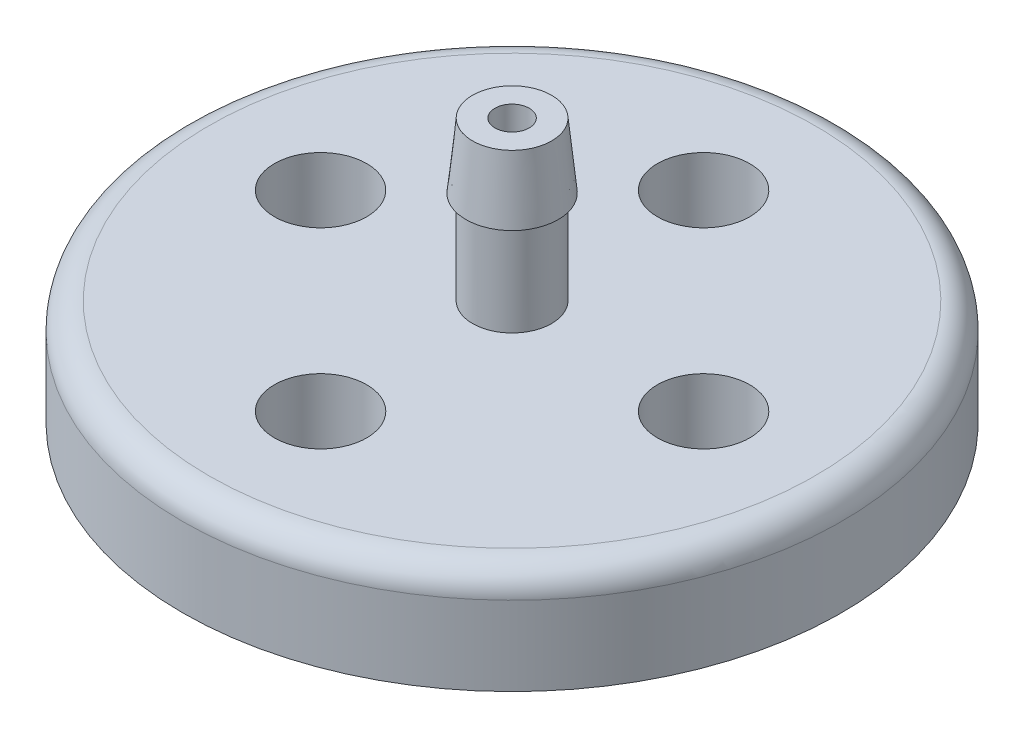
ISO-10303-21;
HEADER;
FILE_DESCRIPTION(('STEP AP214'),'2;1');
FILE_NAME('part.step','',(''),(''),'','','');
FILE_SCHEMA(('AUTOMOTIVE_DESIGN { 1 0 10303 214 1 1 1 1 }'));
ENDSEC;
DATA;
#1=APPLICATION_CONTEXT('core data for automotive mechanical design processes');
#2=APPLICATION_PROTOCOL_DEFINITION('international standard','automotive_design',2000,#1);
#3=PRODUCT_CONTEXT('',#1,'mechanical');
#4=PRODUCT('Part','Part','',(#3));
#5=PRODUCT_RELATED_PRODUCT_CATEGORY('part','',(#4));
#6=PRODUCT_DEFINITION_FORMATION('','',#4);
#7=PRODUCT_DEFINITION_CONTEXT('part definition',#1,'design');
#8=PRODUCT_DEFINITION('design','',#6,#7);
#9=PRODUCT_DEFINITION_SHAPE('','',#8);
#10=(LENGTH_UNIT() NAMED_UNIT(*) SI_UNIT(.MILLI.,.METRE.));
#11=(NAMED_UNIT(*) PLANE_ANGLE_UNIT() SI_UNIT($,.RADIAN.));
#12=(NAMED_UNIT(*) SI_UNIT($,.STERADIAN.) SOLID_ANGLE_UNIT());
#13=UNCERTAINTY_MEASURE_WITH_UNIT(LENGTH_MEASURE(1.E-05),#10,'distance_accuracy_value','');
#14=(GEOMETRIC_REPRESENTATION_CONTEXT(3) GLOBAL_UNCERTAINTY_ASSIGNED_CONTEXT((#13)) GLOBAL_UNIT_ASSIGNED_CONTEXT((#10,
#11,#12)) REPRESENTATION_CONTEXT('',''));
#15=CARTESIAN_POINT('',(0.,0.,0.));
#16=DIRECTION('',(0.,0.,1.));
#17=DIRECTION('',(1.,0.,0.));
#18=AXIS2_PLACEMENT_3D('',#15,#16,#17);
#19=CARTESIAN_POINT('',(0.,4.,0.));
#20=DIRECTION('',(0.,-1.,0.));
#21=DIRECTION('',(0.,0.,-1.));
#22=AXIS2_PLACEMENT_3D('',#19,#20,#21);
#23=CYLINDRICAL_SURFACE('',#22,12.5);
#24=CARTESIAN_POINT('',(0.,3.,0.));
#25=DIRECTION('',(0.,1.,0.));
#26=DIRECTION('',(0.,0.,1.));
#27=AXIS2_PLACEMENT_3D('',#24,#25,#26);
#28=CIRCLE('',#27,12.5);
#29=CARTESIAN_POINT('',(0.,3.,12.5));
#30=VERTEX_POINT('',#29);
#31=EDGE_CURVE('E10',#30,#30,#28,.F.);
#32=ORIENTED_EDGE('',*,*,#31,.T.);
#33=EDGE_LOOP('',(#32));
#34=FACE_BOUND('',#33,.T.);
#35=CARTESIAN_POINT('',(0.,0.,0.));
#36=DIRECTION('',(0.,1.,0.));
#37=DIRECTION('',(0.,0.,1.));
#38=AXIS2_PLACEMENT_3D('',#35,#36,#37);
#39=CIRCLE('',#38,12.5);
#40=CARTESIAN_POINT('',(0.,0.,12.5));
#41=VERTEX_POINT('',#40);
#42=EDGE_CURVE('E51',#41,#41,#39,.T.);
#43=ORIENTED_EDGE('',*,*,#42,.T.);
#44=EDGE_LOOP('',(#43));
#45=FACE_BOUND('',#44,.T.);
#46=ADVANCED_FACE('F37',(#34,#45),#23,.T.);
#47=CARTESIAN_POINT('',(0.,4.,0.));
#48=DIRECTION('',(0.,1.,0.));
#49=DIRECTION('',(0.,0.,1.));
#50=AXIS2_PLACEMENT_3D('',#47,#48,#49);
#51=PLANE('',#50);
#52=CARTESIAN_POINT('',(0.,4.,7.26321078491473));
#53=DIRECTION('',(0.,1.,0.));
#54=DIRECTION('',(0.,0.,1.));
#55=AXIS2_PLACEMENT_3D('',#52,#53,#54);
#56=CIRCLE('',#55,1.75);
#57=CARTESIAN_POINT('',(0.,4.,9.01321078491473));
#58=VERTEX_POINT('',#57);
#59=EDGE_CURVE('E102',#58,#58,#56,.F.);
#60=ORIENTED_EDGE('',*,*,#59,.T.);
#61=EDGE_LOOP('',(#60));
#62=FACE_BOUND('',#61,.T.);
#63=CARTESIAN_POINT('',(7.26321078491473,4.,0.));
#64=DIRECTION('',(0.,1.,0.));
#65=DIRECTION('',(0.,0.,1.));
#66=AXIS2_PLACEMENT_3D('',#63,#64,#65);
#67=CIRCLE('',#66,1.75);
#68=CARTESIAN_POINT('',(7.26321078491473,4.,1.75));
#69=VERTEX_POINT('',#68);
#70=EDGE_CURVE('E94',#69,#69,#67,.F.);
#71=ORIENTED_EDGE('',*,*,#70,.T.);
#72=EDGE_LOOP('',(#71));
#73=FACE_BOUND('',#72,.T.);
#74=CARTESIAN_POINT('',(0.,4.,-7.26321078491473));
#75=DIRECTION('',(0.,1.,0.));
#76=DIRECTION('',(0.,0.,1.));
#77=AXIS2_PLACEMENT_3D('',#74,#75,#76);
#78=CIRCLE('',#77,1.75);
#79=CARTESIAN_POINT('',(0.,4.,-5.51321078491473));
#80=VERTEX_POINT('',#79);
#81=EDGE_CURVE('E86',#80,#80,#78,.F.);
#82=ORIENTED_EDGE('',*,*,#81,.T.);
#83=EDGE_LOOP('',(#82));
#84=FACE_BOUND('',#83,.T.);
#85=CARTESIAN_POINT('',(-7.26321078491473,4.,0.));
#86=DIRECTION('',(0.,1.,0.));
#87=DIRECTION('',(0.,0.,1.));
#88=AXIS2_PLACEMENT_3D('',#85,#86,#87);
#89=CIRCLE('',#88,1.75);
#90=CARTESIAN_POINT('',(-7.26321078491473,4.,1.75));
#91=VERTEX_POINT('',#90);
#92=EDGE_CURVE('E78',#91,#91,#89,.F.);
#93=ORIENTED_EDGE('',*,*,#92,.T.);
#94=EDGE_LOOP('',(#93));
#95=FACE_BOUND('',#94,.T.);
#96=CARTESIAN_POINT('',(0.,4.,0.));
#97=DIRECTION('',(0.,1.,0.));
#98=DIRECTION('',(0.,0.,1.));
#99=AXIS2_PLACEMENT_3D('',#96,#97,#98);
#100=CIRCLE('',#99,11.5);
#101=CARTESIAN_POINT('',(0.,4.,11.5));
#102=VERTEX_POINT('',#101);
#103=EDGE_CURVE('E46',#102,#102,#100,.T.);
#104=ORIENTED_EDGE('',*,*,#103,.T.);
#105=EDGE_LOOP('',(#104));
#106=FACE_BOUND('',#105,.T.);
#107=CARTESIAN_POINT('',(0.,4.,0.));
#108=DIRECTION('',(0.,1.,0.));
#109=DIRECTION('',(0.,0.,1.));
#110=AXIS2_PLACEMENT_3D('',#107,#108,#109);
#111=CIRCLE('',#110,1.5);
#112=CARTESIAN_POINT('',(0.,4.,1.5));
#113=VERTEX_POINT('',#112);
#114=EDGE_CURVE('E57',#113,#113,#111,.T.);
#115=ORIENTED_EDGE('',*,*,#114,.F.);
#116=EDGE_LOOP('',(#115));
#117=FACE_BOUND('',#116,.T.);
#118=ADVANCED_FACE('F116',(#62,#73,#84,#95,#106,#117),#51,.T.);
#119=CARTESIAN_POINT('',(0.,0.,0.));
#120=DIRECTION('',(0.,1.,0.));
#121=DIRECTION('',(0.,0.,1.));
#122=AXIS2_PLACEMENT_3D('',#119,#120,#121);
#123=PLANE('',#122);
#124=CARTESIAN_POINT('',(0.,0.,7.26321078491473));
#125=DIRECTION('',(0.,-1.,0.));
#126=DIRECTION('',(-1.,0.,0.));
#127=AXIS2_PLACEMENT_3D('',#124,#125,#126);
#128=CIRCLE('',#127,1.75);
#129=CARTESIAN_POINT('',(-1.74999999999997,0.,7.26321078491474));
#130=VERTEX_POINT('',#129);
#131=EDGE_CURVE('E82',#130,#130,#128,.T.);
#132=ORIENTED_EDGE('',*,*,#131,.F.);
#133=EDGE_LOOP('',(#132));
#134=FACE_BOUND('',#133,.T.);
#135=CARTESIAN_POINT('',(7.26321078491473,0.,0.));
#136=DIRECTION('',(0.,-1.,0.));
#137=DIRECTION('',(0.,0.,1.));
#138=AXIS2_PLACEMENT_3D('',#135,#136,#137);
#139=CIRCLE('',#138,1.75);
#140=CARTESIAN_POINT('',(7.26321078491473,0.,1.75));
#141=VERTEX_POINT('',#140);
#142=EDGE_CURVE('E98',#141,#141,#139,.T.);
#143=ORIENTED_EDGE('',*,*,#142,.F.);
#144=EDGE_LOOP('',(#143));
#145=FACE_BOUND('',#144,.T.);
#146=CARTESIAN_POINT('',(0.,0.,-7.26321078491473));
#147=DIRECTION('',(0.,-1.,0.));
#148=DIRECTION('',(1.,0.,0.));
#149=AXIS2_PLACEMENT_3D('',#146,#147,#148);
#150=CIRCLE('',#149,1.75);
#151=CARTESIAN_POINT('',(1.74999999999992,0.,-7.26321078491475));
#152=VERTEX_POINT('',#151);
#153=EDGE_CURVE('E90',#152,#152,#150,.T.);
#154=ORIENTED_EDGE('',*,*,#153,.F.);
#155=EDGE_LOOP('',(#154));
#156=FACE_BOUND('',#155,.T.);
#157=CARTESIAN_POINT('',(-7.26321078491473,0.,0.));
#158=DIRECTION('',(0.,-1.,0.));
#159=DIRECTION('',(0.,0.,-1.));
#160=AXIS2_PLACEMENT_3D('',#157,#158,#159);
#161=CIRCLE('',#160,1.75);
#162=CARTESIAN_POINT('',(-7.26321078491473,0.,-1.75));
#163=VERTEX_POINT('',#162);
#164=EDGE_CURVE('E74',#163,#163,#161,.T.);
#165=ORIENTED_EDGE('',*,*,#164,.F.);
#166=EDGE_LOOP('',(#165));
#167=FACE_BOUND('',#166,.T.);
#168=CARTESIAN_POINT('',(0.,0.,0.));
#169=DIRECTION('',(0.,-1.,0.));
#170=DIRECTION('',(0.,0.,-1.));
#171=AXIS2_PLACEMENT_3D('',#168,#169,#170);
#172=CIRCLE('',#171,0.65);
#173=CARTESIAN_POINT('',(0.,0.,-0.65));
#174=VERTEX_POINT('',#173);
#175=EDGE_CURVE('E69',#174,#174,#172,.T.);
#176=ORIENTED_EDGE('',*,*,#175,.F.);
#177=EDGE_LOOP('',(#176));
#178=FACE_BOUND('',#177,.T.);
#179=ORIENTED_EDGE('',*,*,#42,.F.);
#180=EDGE_LOOP('',(#179));
#181=FACE_BOUND('',#180,.T.);
#182=ADVANCED_FACE('F112',(#134,#145,#156,#167,#178,#181),#123,.F.);
#183=CARTESIAN_POINT('',(0.,10.,0.));
#184=DIRECTION('',(0.,-1.,0.));
#185=DIRECTION('',(0.,0.,-1.));
#186=AXIS2_PLACEMENT_3D('',#183,#184,#185);
#187=CYLINDRICAL_SURFACE('',#186,1.5);
#188=CARTESIAN_POINT('',(0.,7.54,0.));
#189=DIRECTION('',(0.,-1.,0.));
#190=DIRECTION('',(0.,0.,-1.));
#191=AXIS2_PLACEMENT_3D('',#188,#189,#190);
#192=CIRCLE('',#191,1.5);
#193=CARTESIAN_POINT('',(0.,7.54,-1.5));
#194=VERTEX_POINT('',#193);
#195=EDGE_CURVE('E41',#194,#194,#192,.T.);
#196=ORIENTED_EDGE('',*,*,#195,.T.);
#197=EDGE_LOOP('',(#196));
#198=FACE_BOUND('',#197,.T.);
#199=ORIENTED_EDGE('',*,*,#114,.T.);
#200=EDGE_LOOP('',(#199));
#201=FACE_BOUND('',#200,.T.);
#202=ADVANCED_FACE('F115',(#198,#201),#187,.T.);
#203=CARTESIAN_POINT('',(0.,3.,0.));
#204=DIRECTION('',(0.,1.,0.));
#205=DIRECTION('',(0.,0.,1.));
#206=AXIS2_PLACEMENT_3D('',#203,#204,#205);
#207=TOROIDAL_SURFACE('',#206,11.5,1.);
#208=ORIENTED_EDGE('',*,*,#31,.F.);
#209=EDGE_LOOP('',(#208));
#210=FACE_BOUND('',#209,.T.);
#211=ORIENTED_EDGE('',*,*,#103,.F.);
#212=EDGE_LOOP('',(#211));
#213=FACE_BOUND('',#212,.T.);
#214=ADVANCED_FACE('F39',(#210,#213),#207,.T.);
#215=CARTESIAN_POINT('',(1.75,7.54,0.));
#216=DIRECTION('',(0.,-1.,0.));
#217=DIRECTION('',(0.,0.,-1.));
#218=AXIS2_PLACEMENT_3D('',#215,#216,#217);
#219=PLANE('',#218);
#220=ORIENTED_EDGE('',*,*,#195,.F.);
#221=EDGE_LOOP('',(#220));
#222=FACE_BOUND('',#221,.T.);
#223=CARTESIAN_POINT('',(0.,7.54,0.));
#224=DIRECTION('',(0.,-1.,0.));
#225=DIRECTION('',(0.,0.,-1.));
#226=AXIS2_PLACEMENT_3D('',#223,#224,#225);
#227=CIRCLE('',#226,1.75);
#228=CARTESIAN_POINT('',(0.,7.54,-1.75));
#229=VERTEX_POINT('',#228);
#230=EDGE_CURVE('E65',#229,#229,#227,.T.);
#231=ORIENTED_EDGE('',*,*,#230,.T.);
#232=EDGE_LOOP('',(#231));
#233=FACE_BOUND('',#232,.T.);
#234=ADVANCED_FACE('F144',(#222,#233),#219,.T.);
#235=CARTESIAN_POINT('',(0.,7.54,0.));
#236=DIRECTION('',(0.,-1.,0.));
#237=DIRECTION('',(0.,0.,-1.));
#238=AXIS2_PLACEMENT_3D('',#235,#236,#237);
#239=CONICAL_SURFACE('',#238,1.75,0.101278309048643);
#240=CARTESIAN_POINT('',(0.,10.,0.));
#241=DIRECTION('',(0.,-1.,0.));
#242=DIRECTION('',(0.,0.,-1.));
#243=AXIS2_PLACEMENT_3D('',#240,#241,#242);
#244=CIRCLE('',#243,1.5);
#245=CARTESIAN_POINT('',(0.,10.,-1.5));
#246=VERTEX_POINT('',#245);
#247=EDGE_CURVE('E61',#246,#246,#244,.T.);
#248=ORIENTED_EDGE('',*,*,#247,.T.);
#249=EDGE_LOOP('',(#248));
#250=FACE_BOUND('',#249,.T.);
#251=ORIENTED_EDGE('',*,*,#230,.F.);
#252=EDGE_LOOP('',(#251));
#253=FACE_BOUND('',#252,.T.);
#254=ADVANCED_FACE('F142',(#250,#253),#239,.T.);
#255=CARTESIAN_POINT('',(0.,10.,0.));
#256=DIRECTION('',(0.,1.,0.));
#257=DIRECTION('',(0.,0.,1.));
#258=AXIS2_PLACEMENT_3D('',#255,#256,#257);
#259=PLANE('',#258);
#260=CARTESIAN_POINT('',(0.,10.,0.));
#261=DIRECTION('',(0.,1.,0.));
#262=DIRECTION('',(0.,0.,1.));
#263=AXIS2_PLACEMENT_3D('',#260,#261,#262);
#264=CIRCLE('',#263,0.65);
#265=CARTESIAN_POINT('',(0.,10.,0.65));
#266=VERTEX_POINT('',#265);
#267=EDGE_CURVE('E70',#266,#266,#264,.F.);
#268=ORIENTED_EDGE('',*,*,#267,.T.);
#269=EDGE_LOOP('',(#268));
#270=FACE_BOUND('',#269,.T.);
#271=ORIENTED_EDGE('',*,*,#247,.F.);
#272=EDGE_LOOP('',(#271));
#273=FACE_BOUND('',#272,.T.);
#274=ADVANCED_FACE('F138',(#270,#273),#259,.T.);
#275=CARTESIAN_POINT('',(0.,10.001,0.));
#276=DIRECTION('',(0.,-1.,0.));
#277=DIRECTION('',(0.,0.,-1.));
#278=AXIS2_PLACEMENT_3D('',#275,#276,#277);
#279=CYLINDRICAL_SURFACE('',#278,0.65);
#280=ORIENTED_EDGE('',*,*,#267,.F.);
#281=EDGE_LOOP('',(#280));
#282=FACE_BOUND('',#281,.T.);
#283=ORIENTED_EDGE('',*,*,#175,.T.);
#284=EDGE_LOOP('',(#283));
#285=FACE_BOUND('',#284,.T.);
#286=ADVANCED_FACE('F141',(#282,#285),#279,.F.);
#287=CARTESIAN_POINT('',(-7.26321078491473,10.001,0.));
#288=DIRECTION('',(0.,-1.,0.));
#289=DIRECTION('',(0.,0.,-1.));
#290=AXIS2_PLACEMENT_3D('',#287,#288,#289);
#291=CYLINDRICAL_SURFACE('',#290,1.75);
#292=ORIENTED_EDGE('',*,*,#92,.F.);
#293=EDGE_LOOP('',(#292));
#294=FACE_BOUND('',#293,.T.);
#295=ORIENTED_EDGE('',*,*,#164,.T.);
#296=EDGE_LOOP('',(#295));
#297=FACE_BOUND('',#296,.T.);
#298=ADVANCED_FACE('F153',(#294,#297),#291,.F.);
#299=CARTESIAN_POINT('',(0.,10.001,-7.26321078491473));
#300=DIRECTION('',(0.,-1.,0.));
#301=DIRECTION('',(0.,0.,-1.));
#302=AXIS2_PLACEMENT_3D('',#299,#300,#301);
#303=CYLINDRICAL_SURFACE('',#302,1.75);
#304=ORIENTED_EDGE('',*,*,#81,.F.);
#305=EDGE_LOOP('',(#304));
#306=FACE_BOUND('',#305,.T.);
#307=ORIENTED_EDGE('',*,*,#153,.T.);
#308=EDGE_LOOP('',(#307));
#309=FACE_BOUND('',#308,.T.);
#310=ADVANCED_FACE('F157',(#306,#309),#303,.F.);
#311=CARTESIAN_POINT('',(7.26321078491473,10.001,0.));
#312=DIRECTION('',(0.,-1.,0.));
#313=DIRECTION('',(0.,0.,-1.));
#314=AXIS2_PLACEMENT_3D('',#311,#312,#313);
#315=CYLINDRICAL_SURFACE('',#314,1.75);
#316=ORIENTED_EDGE('',*,*,#70,.F.);
#317=EDGE_LOOP('',(#316));
#318=FACE_BOUND('',#317,.T.);
#319=ORIENTED_EDGE('',*,*,#142,.T.);
#320=EDGE_LOOP('',(#319));
#321=FACE_BOUND('',#320,.T.);
#322=ADVANCED_FACE('F161',(#318,#321),#315,.F.);
#323=CARTESIAN_POINT('',(0.,10.001,7.26321078491473));
#324=DIRECTION('',(0.,-1.,0.));
#325=DIRECTION('',(0.,0.,-1.));
#326=AXIS2_PLACEMENT_3D('',#323,#324,#325);
#327=CYLINDRICAL_SURFACE('',#326,1.75);
#328=ORIENTED_EDGE('',*,*,#59,.F.);
#329=EDGE_LOOP('',(#328));
#330=FACE_BOUND('',#329,.T.);
#331=ORIENTED_EDGE('',*,*,#131,.T.);
#332=EDGE_LOOP('',(#331));
#333=FACE_BOUND('',#332,.T.);
#334=ADVANCED_FACE('F110',(#330,#333),#327,.F.);
#335=CLOSED_SHELL('',(#46,#118,#182,#202,#214,#234,#254,#274,#286,#298,#310,#322,#334));
#336=MANIFOLD_SOLID_BREP('B2',#335);
#337=ADVANCED_BREP_SHAPE_REPRESENTATION('',(#18,#336),#14);
#338=SHAPE_DEFINITION_REPRESENTATION(#9,#337);
ENDSEC;
END-ISO-10303-21;
